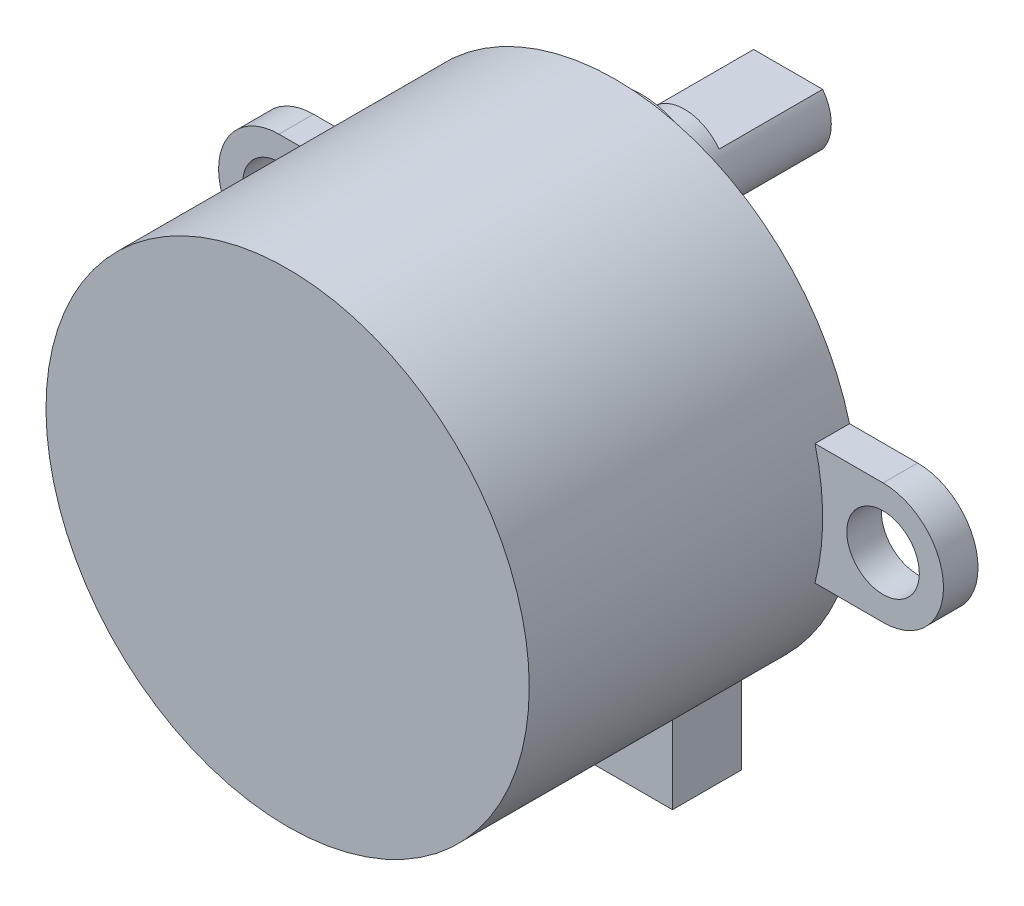
ISO-10303-21;
HEADER;
FILE_DESCRIPTION(('STEP AP214'),'2;1');
FILE_NAME('part.step','',(''),(''),'','','');
FILE_SCHEMA(('AUTOMOTIVE_DESIGN { 1 0 10303 214 1 1 1 1 }'));
ENDSEC;
DATA;
#1=APPLICATION_CONTEXT('core data for automotive mechanical design processes');
#2=APPLICATION_PROTOCOL_DEFINITION('international standard','automotive_design',2000,#1);
#3=PRODUCT_CONTEXT('',#1,'mechanical');
#4=PRODUCT('Part','Part','',(#3));
#5=PRODUCT_RELATED_PRODUCT_CATEGORY('part','',(#4));
#6=PRODUCT_DEFINITION_FORMATION('','',#4);
#7=PRODUCT_DEFINITION_CONTEXT('part definition',#1,'design');
#8=PRODUCT_DEFINITION('design','',#6,#7);
#9=PRODUCT_DEFINITION_SHAPE('','',#8);
#10=(LENGTH_UNIT() NAMED_UNIT(*) SI_UNIT(.MILLI.,.METRE.));
#11=(NAMED_UNIT(*) PLANE_ANGLE_UNIT() SI_UNIT($,.RADIAN.));
#12=(NAMED_UNIT(*) SI_UNIT($,.STERADIAN.) SOLID_ANGLE_UNIT());
#13=UNCERTAINTY_MEASURE_WITH_UNIT(LENGTH_MEASURE(1.E-05),#10,'distance_accuracy_value','');
#14=(GEOMETRIC_REPRESENTATION_CONTEXT(3) GLOBAL_UNCERTAINTY_ASSIGNED_CONTEXT((#13)) GLOBAL_UNIT_ASSIGNED_CONTEXT((#10,
#11,#12)) REPRESENTATION_CONTEXT('',''));
#15=CARTESIAN_POINT('',(0.,0.,0.));
#16=DIRECTION('',(0.,0.,1.));
#17=DIRECTION('',(1.,0.,0.));
#18=AXIS2_PLACEMENT_3D('',#15,#16,#17);
#19=CARTESIAN_POINT('',(0.,0.,19.));
#20=DIRECTION('',(0.,0.,-1.));
#21=DIRECTION('',(-1.,0.,0.));
#22=AXIS2_PLACEMENT_3D('',#19,#20,#21);
#23=CYLINDRICAL_SURFACE('',#22,14.);
#24=CARTESIAN_POINT('',(0.,0.,0.));
#25=DIRECTION('',(0.,0.,1.));
#26=DIRECTION('',(1.,0.,0.));
#27=AXIS2_PLACEMENT_3D('',#24,#25,#26);
#28=CIRCLE('',#27,14.);
#29=CARTESIAN_POINT('',(-13.555441711726,-3.49999999999999,0.));
#30=VERTEX_POINT('',#29);
#31=CARTESIAN_POINT('',(-7.3,-11.9461290801665,0.));
#32=VERTEX_POINT('',#31);
#33=EDGE_CURVE('E299',#30,#32,#28,.T.);
#34=ORIENTED_EDGE('',*,*,#33,.T.);
#35=DIRECTION('',(0.,0.,-1.));
#36=VECTOR('',#35,1.);
#37=CARTESIAN_POINT('',(-7.3,-11.9461290801665,4.));
#38=LINE('',#37,#36);
#39=CARTESIAN_POINT('',(-7.3,-11.9461290801665,4.));
#40=VERTEX_POINT('',#39);
#41=EDGE_CURVE('E222',#40,#32,#38,.T.);
#42=ORIENTED_EDGE('',*,*,#41,.F.);
#43=CARTESIAN_POINT('',(0.,0.,4.));
#44=DIRECTION('',(0.,0.,1.));
#45=DIRECTION('',(1.,0.,0.));
#46=AXIS2_PLACEMENT_3D('',#43,#44,#45);
#47=CIRCLE('',#46,14.);
#48=CARTESIAN_POINT('',(7.3,-11.9461290801665,4.));
#49=VERTEX_POINT('',#48);
#50=EDGE_CURVE('E196',#40,#49,#47,.T.);
#51=ORIENTED_EDGE('',*,*,#50,.T.);
#52=DIRECTION('',(0.,0.,-1.));
#53=VECTOR('',#52,1.);
#54=CARTESIAN_POINT('',(7.3,-11.9461290801665,4.));
#55=LINE('',#54,#53);
#56=CARTESIAN_POINT('',(7.3,-11.9461290801665,0.));
#57=VERTEX_POINT('',#56);
#58=EDGE_CURVE('E208',#49,#57,#55,.T.);
#59=ORIENTED_EDGE('',*,*,#58,.T.);
#60=CARTESIAN_POINT('',(13.555441711726,-3.49999999999999,0.));
#61=VERTEX_POINT('',#60);
#62=EDGE_CURVE('E298',#57,#61,#28,.T.);
#63=ORIENTED_EDGE('',*,*,#62,.T.);
#64=DIRECTION('',(0.,0.,-1.));
#65=VECTOR('',#64,1.);
#66=CARTESIAN_POINT('',(13.555441711726,-3.49999999999999,2.));
#67=LINE('',#66,#65);
#68=CARTESIAN_POINT('',(13.555441711726,-3.49999999999999,2.));
#69=VERTEX_POINT('',#68);
#70=EDGE_CURVE('E278',#69,#61,#67,.T.);
#71=ORIENTED_EDGE('',*,*,#70,.F.);
#72=CARTESIAN_POINT('',(0.,0.,2.));
#73=DIRECTION('',(0.,0.,1.));
#74=DIRECTION('',(1.,0.,0.));
#75=AXIS2_PLACEMENT_3D('',#72,#73,#74);
#76=CIRCLE('',#75,14.);
#77=CARTESIAN_POINT('',(13.555441711726,3.50000000000001,2.));
#78=VERTEX_POINT('',#77);
#79=EDGE_CURVE('E276',#69,#78,#76,.T.);
#80=ORIENTED_EDGE('',*,*,#79,.T.);
#81=DIRECTION('',(0.,0.,-1.));
#82=VECTOR('',#81,1.);
#83=CARTESIAN_POINT('',(13.555441711726,3.50000000000001,2.));
#84=LINE('',#83,#82);
#85=CARTESIAN_POINT('',(13.555441711726,3.50000000000001,0.));
#86=VERTEX_POINT('',#85);
#87=EDGE_CURVE('E291',#78,#86,#84,.T.);
#88=ORIENTED_EDGE('',*,*,#87,.T.);
#89=CARTESIAN_POINT('',(-13.555441711726,3.50000000000001,0.));
#90=VERTEX_POINT('',#89);
#91=EDGE_CURVE('E49',#86,#90,#28,.T.);
#92=ORIENTED_EDGE('',*,*,#91,.T.);
#93=DIRECTION('',(0.,0.,-1.));
#94=VECTOR('',#93,1.);
#95=CARTESIAN_POINT('',(-13.555441711726,3.50000000000001,2.));
#96=LINE('',#95,#94);
#97=CARTESIAN_POINT('',(-13.555441711726,3.50000000000001,2.));
#98=VERTEX_POINT('',#97);
#99=EDGE_CURVE('E256',#98,#90,#96,.T.);
#100=ORIENTED_EDGE('',*,*,#99,.F.);
#101=CARTESIAN_POINT('',(0.,0.,2.));
#102=DIRECTION('',(0.,0.,-1.));
#103=DIRECTION('',(-1.,0.,0.));
#104=AXIS2_PLACEMENT_3D('',#101,#102,#103);
#105=CIRCLE('',#104,14.);
#106=CARTESIAN_POINT('',(-13.555441711726,-3.49999999999999,2.));
#107=VERTEX_POINT('',#106);
#108=EDGE_CURVE('E233',#107,#98,#105,.T.);
#109=ORIENTED_EDGE('',*,*,#108,.F.);
#110=DIRECTION('',(0.,0.,-1.));
#111=VECTOR('',#110,1.);
#112=CARTESIAN_POINT('',(-13.555441711726,-3.49999999999999,2.));
#113=LINE('',#112,#111);
#114=EDGE_CURVE('E259',#107,#30,#113,.T.);
#115=ORIENTED_EDGE('',*,*,#114,.T.);
#116=EDGE_LOOP('',(#34,#42,#51,#59,#63,#71,#80,#88,#92,#100,#109,#115));
#117=FACE_BOUND('',#116,.T.);
#118=CARTESIAN_POINT('',(0.,0.,19.));
#119=DIRECTION('',(0.,0.,1.));
#120=DIRECTION('',(1.,0.,0.));
#121=AXIS2_PLACEMENT_3D('',#118,#119,#120);
#122=CIRCLE('',#121,14.);
#123=CARTESIAN_POINT('',(14.,0.,19.));
#124=VERTEX_POINT('',#123);
#125=EDGE_CURVE('E11',#124,#124,#122,.T.);
#126=ORIENTED_EDGE('',*,*,#125,.F.);
#127=EDGE_LOOP('',(#126));
#128=FACE_BOUND('',#127,.T.);
#129=ADVANCED_FACE('F41',(#117,#128),#23,.T.);
#130=CARTESIAN_POINT('',(0.,0.,19.));
#131=DIRECTION('',(0.,0.,1.));
#132=DIRECTION('',(1.,0.,0.));
#133=AXIS2_PLACEMENT_3D('',#130,#131,#132);
#134=PLANE('',#133);
#135=ORIENTED_EDGE('',*,*,#125,.T.);
#136=EDGE_LOOP('',(#135));
#137=FACE_BOUND('',#136,.T.);
#138=ADVANCED_FACE('F334',(#137),#134,.T.);
#139=CARTESIAN_POINT('',(0.,0.,0.));
#140=DIRECTION('',(0.,0.,1.));
#141=DIRECTION('',(1.,0.,0.));
#142=AXIS2_PLACEMENT_3D('',#139,#140,#141);
#143=PLANE('',#142);
#144=CARTESIAN_POINT('',(0.,8.,0.));
#145=DIRECTION('',(0.,0.,1.));
#146=DIRECTION('',(1.,0.,0.));
#147=AXIS2_PLACEMENT_3D('',#144,#145,#146);
#148=CIRCLE('',#147,4.5);
#149=CARTESIAN_POINT('',(4.5,8.,0.));
#150=VERTEX_POINT('',#149);
#151=EDGE_CURVE('E193',#150,#150,#148,.T.);
#152=ORIENTED_EDGE('',*,*,#151,.T.);
#153=EDGE_LOOP('',(#152));
#154=FACE_BOUND('',#153,.T.);
#155=ORIENTED_EDGE('',*,*,#91,.F.);
#156=DIRECTION('',(-1.,0.,0.));
#157=VECTOR('',#156,1.);
#158=CARTESIAN_POINT('',(0.,3.50000000000001,0.));
#159=LINE('',#158,#157);
#160=CARTESIAN_POINT('',(17.5,3.50000000000001,0.));
#161=VERTEX_POINT('',#160);
#162=EDGE_CURVE('E267',#161,#86,#159,.T.);
#163=ORIENTED_EDGE('',*,*,#162,.F.);
#164=CARTESIAN_POINT('',(17.5,0.,0.));
#165=DIRECTION('',(0.,0.,1.));
#166=DIRECTION('',(1.,0.,0.));
#167=AXIS2_PLACEMENT_3D('',#164,#165,#166);
#168=CIRCLE('',#167,3.5);
#169=CARTESIAN_POINT('',(17.5,-3.49999999999999,0.));
#170=VERTEX_POINT('',#169);
#171=EDGE_CURVE('E284',#170,#161,#168,.T.);
#172=ORIENTED_EDGE('',*,*,#171,.F.);
#173=DIRECTION('',(-1.,0.,0.));
#174=VECTOR('',#173,1.);
#175=CARTESIAN_POINT('',(0.,-3.49999999999999,0.));
#176=LINE('',#175,#174);
#177=EDGE_CURVE('E281',#170,#61,#176,.T.);
#178=ORIENTED_EDGE('',*,*,#177,.T.);
#179=ORIENTED_EDGE('',*,*,#62,.F.);
#180=DIRECTION('',(0.,-1.,0.));
#181=VECTOR('',#180,1.);
#182=CARTESIAN_POINT('',(7.3,0.,0.));
#183=LINE('',#182,#181);
#184=CARTESIAN_POINT('',(7.3,-17.,0.));
#185=VERTEX_POINT('',#184);
#186=EDGE_CURVE('E199',#57,#185,#183,.T.);
#187=ORIENTED_EDGE('',*,*,#186,.T.);
#188=DIRECTION('',(-1.,0.,0.));
#189=VECTOR('',#188,1.);
#190=CARTESIAN_POINT('',(0.,-17.,0.));
#191=LINE('',#190,#189);
#192=CARTESIAN_POINT('',(-7.3,-17.,0.));
#193=VERTEX_POINT('',#192);
#194=EDGE_CURVE('E211',#185,#193,#191,.T.);
#195=ORIENTED_EDGE('',*,*,#194,.T.);
#196=DIRECTION('',(0.,1.,0.));
#197=VECTOR('',#196,1.);
#198=CARTESIAN_POINT('',(-7.3,0.,0.));
#199=LINE('',#198,#197);
#200=EDGE_CURVE('E192',#193,#32,#199,.T.);
#201=ORIENTED_EDGE('',*,*,#200,.T.);
#202=ORIENTED_EDGE('',*,*,#33,.F.);
#203=DIRECTION('',(1.,0.,0.));
#204=VECTOR('',#203,1.);
#205=CARTESIAN_POINT('',(0.,-3.49999999999999,0.));
#206=LINE('',#205,#204);
#207=CARTESIAN_POINT('',(-17.5,-3.49999999999999,0.));
#208=VERTEX_POINT('',#207);
#209=EDGE_CURVE('E245',#208,#30,#206,.T.);
#210=ORIENTED_EDGE('',*,*,#209,.F.);
#211=CARTESIAN_POINT('',(-17.5,0.,0.));
#212=DIRECTION('',(0.,0.,-1.));
#213=DIRECTION('',(-1.,0.,0.));
#214=AXIS2_PLACEMENT_3D('',#211,#212,#213);
#215=CIRCLE('',#214,3.5);
#216=CARTESIAN_POINT('',(-17.5,3.50000000000001,0.));
#217=VERTEX_POINT('',#216);
#218=EDGE_CURVE('E230',#208,#217,#215,.T.);
#219=ORIENTED_EDGE('',*,*,#218,.T.);
#220=DIRECTION('',(1.,0.,0.));
#221=VECTOR('',#220,1.);
#222=CARTESIAN_POINT('',(0.,3.50000000000001,0.));
#223=LINE('',#222,#221);
#224=EDGE_CURVE('E248',#217,#90,#223,.T.);
#225=ORIENTED_EDGE('',*,*,#224,.T.);
#226=EDGE_LOOP('',(#155,#163,#172,#178,#179,#187,#195,#201,#202,#210,#219,#225));
#227=FACE_BOUND('',#226,.T.);
#228=CARTESIAN_POINT('',(17.5,0.,0.));
#229=DIRECTION('',(0.,0.,1.));
#230=DIRECTION('',(1.,0.,0.));
#231=AXIS2_PLACEMENT_3D('',#228,#229,#230);
#232=CIRCLE('',#231,2.1);
#233=CARTESIAN_POINT('',(19.6,0.,0.));
#234=VERTEX_POINT('',#233);
#235=EDGE_CURVE('E262',#234,#234,#232,.T.);
#236=ORIENTED_EDGE('',*,*,#235,.T.);
#237=EDGE_LOOP('',(#236));
#238=FACE_BOUND('',#237,.T.);
#239=CARTESIAN_POINT('',(-17.5,0.,0.));
#240=DIRECTION('',(0.,0.,-1.));
#241=DIRECTION('',(-1.,0.,0.));
#242=AXIS2_PLACEMENT_3D('',#239,#240,#241);
#243=CIRCLE('',#242,2.1);
#244=CARTESIAN_POINT('',(-19.6,0.,0.));
#245=VERTEX_POINT('',#244);
#246=EDGE_CURVE('E225',#245,#245,#243,.T.);
#247=ORIENTED_EDGE('',*,*,#246,.F.);
#248=EDGE_LOOP('',(#247));
#249=FACE_BOUND('',#248,.T.);
#250=ADVANCED_FACE('F311',(#154,#227,#238,#249),#143,.F.);
#251=CARTESIAN_POINT('',(0.,-3.49999999999999,2.));
#252=DIRECTION('',(0.,-1.,0.));
#253=DIRECTION('',(0.,0.,-1.));
#254=AXIS2_PLACEMENT_3D('',#251,#252,#253);
#255=PLANE('',#254);
#256=ORIENTED_EDGE('',*,*,#177,.F.);
#257=DIRECTION('',(0.,0.,-1.));
#258=VECTOR('',#257,1.);
#259=CARTESIAN_POINT('',(17.5,-3.49999999999999,2.));
#260=LINE('',#259,#258);
#261=CARTESIAN_POINT('',(17.5,-3.49999999999999,2.));
#262=VERTEX_POINT('',#261);
#263=EDGE_CURVE('E297',#262,#170,#260,.T.);
#264=ORIENTED_EDGE('',*,*,#263,.F.);
#265=DIRECTION('',(-1.,0.,0.));
#266=VECTOR('',#265,1.);
#267=CARTESIAN_POINT('',(0.,-3.49999999999999,2.));
#268=LINE('',#267,#266);
#269=EDGE_CURVE('E266',#262,#69,#268,.T.);
#270=ORIENTED_EDGE('',*,*,#269,.T.);
#271=ORIENTED_EDGE('',*,*,#70,.T.);
#272=EDGE_LOOP('',(#256,#264,#270,#271));
#273=FACE_BOUND('',#272,.T.);
#274=ADVANCED_FACE('F307',(#273),#255,.T.);
#275=CARTESIAN_POINT('',(17.5,0.,2.));
#276=DIRECTION('',(0.,0.,-1.));
#277=DIRECTION('',(-1.,0.,0.));
#278=AXIS2_PLACEMENT_3D('',#275,#276,#277);
#279=CYLINDRICAL_SURFACE('',#278,3.5);
#280=ORIENTED_EDGE('',*,*,#171,.T.);
#281=DIRECTION('',(0.,0.,-1.));
#282=VECTOR('',#281,1.);
#283=CARTESIAN_POINT('',(17.5,3.50000000000001,2.));
#284=LINE('',#283,#282);
#285=CARTESIAN_POINT('',(17.5,3.50000000000001,2.));
#286=VERTEX_POINT('',#285);
#287=EDGE_CURVE('E294',#286,#161,#284,.T.);
#288=ORIENTED_EDGE('',*,*,#287,.F.);
#289=CARTESIAN_POINT('',(17.5,0.,2.));
#290=DIRECTION('',(0.,0.,1.));
#291=DIRECTION('',(1.,0.,0.));
#292=AXIS2_PLACEMENT_3D('',#289,#290,#291);
#293=CIRCLE('',#292,3.5);
#294=EDGE_CURVE('E270',#262,#286,#293,.T.);
#295=ORIENTED_EDGE('',*,*,#294,.F.);
#296=ORIENTED_EDGE('',*,*,#263,.T.);
#297=EDGE_LOOP('',(#280,#288,#295,#296));
#298=FACE_BOUND('',#297,.T.);
#299=ADVANCED_FACE('F315',(#298),#279,.T.);
#300=CARTESIAN_POINT('',(0.,3.50000000000001,2.));
#301=DIRECTION('',(0.,-1.,0.));
#302=DIRECTION('',(0.,0.,-1.));
#303=AXIS2_PLACEMENT_3D('',#300,#301,#302);
#304=PLANE('',#303);
#305=ORIENTED_EDGE('',*,*,#162,.T.);
#306=ORIENTED_EDGE('',*,*,#87,.F.);
#307=DIRECTION('',(-1.,0.,0.));
#308=VECTOR('',#307,1.);
#309=CARTESIAN_POINT('',(0.,3.50000000000001,2.));
#310=LINE('',#309,#308);
#311=EDGE_CURVE('E273',#286,#78,#310,.T.);
#312=ORIENTED_EDGE('',*,*,#311,.F.);
#313=ORIENTED_EDGE('',*,*,#287,.T.);
#314=EDGE_LOOP('',(#305,#306,#312,#313));
#315=FACE_BOUND('',#314,.T.);
#316=ADVANCED_FACE('F321',(#315),#304,.F.);
#317=CARTESIAN_POINT('',(17.5,0.,2.));
#318=DIRECTION('',(0.,0.,-1.));
#319=DIRECTION('',(-1.,0.,0.));
#320=AXIS2_PLACEMENT_3D('',#317,#318,#319);
#321=CYLINDRICAL_SURFACE('',#320,2.1);
#322=CARTESIAN_POINT('',(17.5,0.,2.));
#323=DIRECTION('',(0.,0.,1.));
#324=DIRECTION('',(1.,0.,0.));
#325=AXIS2_PLACEMENT_3D('',#322,#323,#324);
#326=CIRCLE('',#325,2.1);
#327=CARTESIAN_POINT('',(19.6,0.,2.));
#328=VERTEX_POINT('',#327);
#329=EDGE_CURVE('E263',#328,#328,#326,.T.);
#330=ORIENTED_EDGE('',*,*,#329,.T.);
#331=EDGE_LOOP('',(#330));
#332=FACE_BOUND('',#331,.T.);
#333=ORIENTED_EDGE('',*,*,#235,.F.);
#334=EDGE_LOOP('',(#333));
#335=FACE_BOUND('',#334,.T.);
#336=ADVANCED_FACE('F323',(#332,#335),#321,.F.);
#337=CARTESIAN_POINT('',(0.,0.,2.));
#338=DIRECTION('',(0.,0.,1.));
#339=DIRECTION('',(1.,0.,0.));
#340=AXIS2_PLACEMENT_3D('',#337,#338,#339);
#341=PLANE('',#340);
#342=ORIENTED_EDGE('',*,*,#329,.F.);
#343=EDGE_LOOP('',(#342));
#344=FACE_BOUND('',#343,.T.);
#345=ORIENTED_EDGE('',*,*,#269,.F.);
#346=ORIENTED_EDGE('',*,*,#294,.T.);
#347=ORIENTED_EDGE('',*,*,#311,.T.);
#348=ORIENTED_EDGE('',*,*,#79,.F.);
#349=EDGE_LOOP('',(#345,#346,#347,#348));
#350=FACE_BOUND('',#349,.T.);
#351=ADVANCED_FACE('F318',(#344,#350),#341,.T.);
#352=CARTESIAN_POINT('',(0.,-3.49999999999999,2.));
#353=DIRECTION('',(0.,1.,0.));
#354=DIRECTION('',(0.,0.,1.));
#355=AXIS2_PLACEMENT_3D('',#352,#353,#354);
#356=PLANE('',#355);
#357=ORIENTED_EDGE('',*,*,#209,.T.);
#358=ORIENTED_EDGE('',*,*,#114,.F.);
#359=DIRECTION('',(1.,0.,0.));
#360=VECTOR('',#359,1.);
#361=CARTESIAN_POINT('',(0.,-3.49999999999999,2.));
#362=LINE('',#361,#360);
#363=CARTESIAN_POINT('',(-17.5,-3.49999999999999,2.));
#364=VERTEX_POINT('',#363);
#365=EDGE_CURVE('E229',#364,#107,#362,.T.);
#366=ORIENTED_EDGE('',*,*,#365,.F.);
#367=DIRECTION('',(0.,0.,-1.));
#368=VECTOR('',#367,1.);
#369=CARTESIAN_POINT('',(-17.5,-3.49999999999999,2.));
#370=LINE('',#369,#368);
#371=EDGE_CURVE('E242',#364,#208,#370,.T.);
#372=ORIENTED_EDGE('',*,*,#371,.T.);
#373=EDGE_LOOP('',(#357,#358,#366,#372));
#374=FACE_BOUND('',#373,.T.);
#375=ADVANCED_FACE('F376',(#374),#356,.F.);
#376=CARTESIAN_POINT('',(0.,3.50000000000001,2.));
#377=DIRECTION('',(0.,1.,0.));
#378=DIRECTION('',(0.,0.,1.));
#379=AXIS2_PLACEMENT_3D('',#376,#377,#378);
#380=PLANE('',#379);
#381=ORIENTED_EDGE('',*,*,#224,.F.);
#382=DIRECTION('',(0.,0.,-1.));
#383=VECTOR('',#382,1.);
#384=CARTESIAN_POINT('',(-17.5,3.50000000000001,2.));
#385=LINE('',#384,#383);
#386=CARTESIAN_POINT('',(-17.5,3.50000000000001,2.));
#387=VERTEX_POINT('',#386);
#388=EDGE_CURVE('E254',#387,#217,#385,.T.);
#389=ORIENTED_EDGE('',*,*,#388,.F.);
#390=DIRECTION('',(1.,0.,0.));
#391=VECTOR('',#390,1.);
#392=CARTESIAN_POINT('',(0.,3.50000000000001,2.));
#393=LINE('',#392,#391);
#394=EDGE_CURVE('E236',#387,#98,#393,.T.);
#395=ORIENTED_EDGE('',*,*,#394,.T.);
#396=ORIENTED_EDGE('',*,*,#99,.T.);
#397=EDGE_LOOP('',(#381,#389,#395,#396));
#398=FACE_BOUND('',#397,.T.);
#399=ADVANCED_FACE('F400',(#398),#380,.T.);
#400=CARTESIAN_POINT('',(-17.5,0.,2.));
#401=DIRECTION('',(0.,0.,-1.));
#402=DIRECTION('',(-1.,0.,0.));
#403=AXIS2_PLACEMENT_3D('',#400,#401,#402);
#404=CYLINDRICAL_SURFACE('',#403,2.1);
#405=CARTESIAN_POINT('',(-17.5,0.,2.));
#406=DIRECTION('',(0.,0.,-1.));
#407=DIRECTION('',(-1.,0.,0.));
#408=AXIS2_PLACEMENT_3D('',#405,#406,#407);
#409=CIRCLE('',#408,2.1);
#410=CARTESIAN_POINT('',(-19.6,0.,2.));
#411=VERTEX_POINT('',#410);
#412=EDGE_CURVE('E226',#411,#411,#409,.T.);
#413=ORIENTED_EDGE('',*,*,#412,.F.);
#414=EDGE_LOOP('',(#413));
#415=FACE_BOUND('',#414,.T.);
#416=ORIENTED_EDGE('',*,*,#246,.T.);
#417=EDGE_LOOP('',(#416));
#418=FACE_BOUND('',#417,.T.);
#419=ADVANCED_FACE('F410',(#415,#418),#404,.F.);
#420=CARTESIAN_POINT('',(-17.5,0.,2.));
#421=DIRECTION('',(0.,0.,-1.));
#422=DIRECTION('',(-1.,0.,0.));
#423=AXIS2_PLACEMENT_3D('',#420,#421,#422);
#424=CYLINDRICAL_SURFACE('',#423,3.5);
#425=ORIENTED_EDGE('',*,*,#218,.F.);
#426=ORIENTED_EDGE('',*,*,#371,.F.);
#427=CARTESIAN_POINT('',(-17.5,0.,2.));
#428=DIRECTION('',(0.,0.,-1.));
#429=DIRECTION('',(-1.,0.,0.));
#430=AXIS2_PLACEMENT_3D('',#427,#428,#429);
#431=CIRCLE('',#430,3.5);
#432=EDGE_CURVE('E239',#364,#387,#431,.T.);
#433=ORIENTED_EDGE('',*,*,#432,.T.);
#434=ORIENTED_EDGE('',*,*,#388,.T.);
#435=EDGE_LOOP('',(#425,#426,#433,#434));
#436=FACE_BOUND('',#435,.T.);
#437=ADVANCED_FACE('F420',(#436),#424,.T.);
#438=CARTESIAN_POINT('',(0.,0.,2.));
#439=DIRECTION('',(0.,0.,1.));
#440=DIRECTION('',(-1.,0.,0.));
#441=AXIS2_PLACEMENT_3D('',#438,#439,#440);
#442=PLANE('',#441);
#443=ORIENTED_EDGE('',*,*,#412,.T.);
#444=EDGE_LOOP('',(#443));
#445=FACE_BOUND('',#444,.T.);
#446=ORIENTED_EDGE('',*,*,#365,.T.);
#447=ORIENTED_EDGE('',*,*,#108,.T.);
#448=ORIENTED_EDGE('',*,*,#394,.F.);
#449=ORIENTED_EDGE('',*,*,#432,.F.);
#450=EDGE_LOOP('',(#446,#447,#448,#449));
#451=FACE_BOUND('',#450,.T.);
#452=ADVANCED_FACE('F429',(#445,#451),#442,.T.);
#453=CARTESIAN_POINT('',(-7.3,0.,4.));
#454=DIRECTION('',(-1.,0.,0.));
#455=DIRECTION('',(0.,0.,1.));
#456=AXIS2_PLACEMENT_3D('',#453,#454,#455);
#457=PLANE('',#456);
#458=ORIENTED_EDGE('',*,*,#200,.F.);
#459=DIRECTION('',(0.,0.,-1.));
#460=VECTOR('',#459,1.);
#461=CARTESIAN_POINT('',(-7.3,-17.,4.));
#462=LINE('',#461,#460);
#463=CARTESIAN_POINT('',(-7.3,-17.,4.));
#464=VERTEX_POINT('',#463);
#465=EDGE_CURVE('E220',#464,#193,#462,.T.);
#466=ORIENTED_EDGE('',*,*,#465,.F.);
#467=DIRECTION('',(0.,1.,0.));
#468=VECTOR('',#467,1.);
#469=CARTESIAN_POINT('',(-7.3,0.,4.));
#470=LINE('',#469,#468);
#471=EDGE_CURVE('E198',#464,#40,#470,.T.);
#472=ORIENTED_EDGE('',*,*,#471,.T.);
#473=ORIENTED_EDGE('',*,*,#41,.T.);
#474=EDGE_LOOP('',(#458,#466,#472,#473));
#475=FACE_BOUND('',#474,.T.);
#476=ADVANCED_FACE('F437',(#475),#457,.T.);
#477=CARTESIAN_POINT('',(0.,-17.,4.));
#478=DIRECTION('',(0.,-1.,0.));
#479=DIRECTION('',(0.,0.,-1.));
#480=AXIS2_PLACEMENT_3D('',#477,#478,#479);
#481=PLANE('',#480);
#482=ORIENTED_EDGE('',*,*,#194,.F.);
#483=DIRECTION('',(0.,0.,-1.));
#484=VECTOR('',#483,1.);
#485=CARTESIAN_POINT('',(7.3,-17.,4.));
#486=LINE('',#485,#484);
#487=CARTESIAN_POINT('',(7.3,-17.,4.));
#488=VERTEX_POINT('',#487);
#489=EDGE_CURVE('E218',#488,#185,#486,.T.);
#490=ORIENTED_EDGE('',*,*,#489,.F.);
#491=DIRECTION('',(-1.,0.,0.));
#492=VECTOR('',#491,1.);
#493=CARTESIAN_POINT('',(0.,-17.,4.));
#494=LINE('',#493,#492);
#495=EDGE_CURVE('E202',#488,#464,#494,.T.);
#496=ORIENTED_EDGE('',*,*,#495,.T.);
#497=ORIENTED_EDGE('',*,*,#465,.T.);
#498=EDGE_LOOP('',(#482,#490,#496,#497));
#499=FACE_BOUND('',#498,.T.);
#500=ADVANCED_FACE('F445',(#499),#481,.T.);
#501=CARTESIAN_POINT('',(7.3,0.,4.));
#502=DIRECTION('',(1.,0.,0.));
#503=DIRECTION('',(0.,0.,-1.));
#504=AXIS2_PLACEMENT_3D('',#501,#502,#503);
#505=PLANE('',#504);
#506=ORIENTED_EDGE('',*,*,#186,.F.);
#507=ORIENTED_EDGE('',*,*,#58,.F.);
#508=DIRECTION('',(0.,-1.,0.));
#509=VECTOR('',#508,1.);
#510=CARTESIAN_POINT('',(7.3,0.,4.));
#511=LINE('',#510,#509);
#512=EDGE_CURVE('E205',#49,#488,#511,.T.);
#513=ORIENTED_EDGE('',*,*,#512,.T.);
#514=ORIENTED_EDGE('',*,*,#489,.T.);
#515=EDGE_LOOP('',(#506,#507,#513,#514));
#516=FACE_BOUND('',#515,.T.);
#517=ADVANCED_FACE('F454',(#516),#505,.T.);
#518=CARTESIAN_POINT('',(0.,0.,4.));
#519=DIRECTION('',(0.,0.,1.));
#520=DIRECTION('',(1.,0.,0.));
#521=AXIS2_PLACEMENT_3D('',#518,#519,#520);
#522=PLANE('',#521);
#523=ORIENTED_EDGE('',*,*,#50,.F.);
#524=ORIENTED_EDGE('',*,*,#471,.F.);
#525=ORIENTED_EDGE('',*,*,#495,.F.);
#526=ORIENTED_EDGE('',*,*,#512,.F.);
#527=EDGE_LOOP('',(#523,#524,#525,#526));
#528=FACE_BOUND('',#527,.T.);
#529=ADVANCED_FACE('F463',(#528),#522,.T.);
#530=CARTESIAN_POINT('',(0.,8.,-1.5));
#531=DIRECTION('',(0.,0.,1.));
#532=DIRECTION('',(1.,0.,0.));
#533=AXIS2_PLACEMENT_3D('',#530,#531,#532);
#534=CYLINDRICAL_SURFACE('',#533,4.5);
#535=CARTESIAN_POINT('',(0.,8.,-1.5));
#536=DIRECTION('',(0.,0.,1.));
#537=DIRECTION('',(1.,0.,0.));
#538=AXIS2_PLACEMENT_3D('',#535,#536,#537);
#539=CIRCLE('',#538,4.5);
#540=CARTESIAN_POINT('',(4.5,8.,-1.5));
#541=VERTEX_POINT('',#540);
#542=EDGE_CURVE('E189',#541,#541,#539,.T.);
#543=ORIENTED_EDGE('',*,*,#542,.T.);
#544=EDGE_LOOP('',(#543));
#545=FACE_BOUND('',#544,.T.);
#546=ORIENTED_EDGE('',*,*,#151,.F.);
#547=EDGE_LOOP('',(#546));
#548=FACE_BOUND('',#547,.T.);
#549=ADVANCED_FACE('F472',(#545,#548),#534,.T.);
#550=CARTESIAN_POINT('',(0.,8.,-1.5));
#551=DIRECTION('',(0.,0.,1.));
#552=DIRECTION('',(1.,0.,0.));
#553=AXIS2_PLACEMENT_3D('',#550,#551,#552);
#554=PLANE('',#553);
#555=CARTESIAN_POINT('',(0.,8.,-1.5));
#556=DIRECTION('',(0.,0.,1.));
#557=DIRECTION('',(1.,0.,0.));
#558=AXIS2_PLACEMENT_3D('',#555,#556,#557);
#559=CIRCLE('',#558,2.5);
#560=CARTESIAN_POINT('',(2.5,8.,-1.5));
#561=VERTEX_POINT('',#560);
#562=EDGE_CURVE('E44',#561,#561,#559,.T.);
#563=ORIENTED_EDGE('',*,*,#562,.T.);
#564=EDGE_LOOP('',(#563));
#565=FACE_BOUND('',#564,.T.);
#566=ORIENTED_EDGE('',*,*,#542,.F.);
#567=EDGE_LOOP('',(#566));
#568=FACE_BOUND('',#567,.T.);
#569=ADVANCED_FACE('F481',(#565,#568),#554,.F.);
#570=CARTESIAN_POINT('',(0.,8.,-10.));
#571=DIRECTION('',(0.,0.,1.));
#572=DIRECTION('',(1.,0.,0.));
#573=AXIS2_PLACEMENT_3D('',#570,#571,#572);
#574=CYLINDRICAL_SURFACE('',#573,2.5);
#575=DIRECTION('',(0.,0.,-1.));
#576=VECTOR('',#575,1.);
#577=CARTESIAN_POINT('',(2.,9.5,-4.));
#578=LINE('',#577,#576);
#579=CARTESIAN_POINT('',(2.,9.5,-4.));
#580=VERTEX_POINT('',#579);
#581=CARTESIAN_POINT('',(2.,9.5,-10.));
#582=VERTEX_POINT('',#581);
#583=EDGE_CURVE('E65',#580,#582,#578,.T.);
#584=ORIENTED_EDGE('',*,*,#583,.F.);
#585=CARTESIAN_POINT('',(0.,8.,-4.));
#586=DIRECTION('',(0.,0.,-1.));
#587=DIRECTION('',(-1.,0.,0.));
#588=AXIS2_PLACEMENT_3D('',#585,#586,#587);
#589=CIRCLE('',#588,2.5);
#590=CARTESIAN_POINT('',(-2.,9.5,-4.));
#591=VERTEX_POINT('',#590);
#592=EDGE_CURVE('E157',#591,#580,#589,.T.);
#593=ORIENTED_EDGE('',*,*,#592,.F.);
#594=DIRECTION('',(0.,0.,-1.));
#595=VECTOR('',#594,1.);
#596=CARTESIAN_POINT('',(-2.,9.5,-4.));
#597=LINE('',#596,#595);
#598=CARTESIAN_POINT('',(-2.,9.5,-10.));
#599=VERTEX_POINT('',#598);
#600=EDGE_CURVE('E165',#591,#599,#597,.T.);
#601=ORIENTED_EDGE('',*,*,#600,.T.);
#602=CARTESIAN_POINT('',(0.,8.,-10.));
#603=DIRECTION('',(0.,0.,1.));
#604=DIRECTION('',(1.,0.,0.));
#605=AXIS2_PLACEMENT_3D('',#602,#603,#604);
#606=CIRCLE('',#605,2.5);
#607=CARTESIAN_POINT('',(-2.,6.5,-10.));
#608=VERTEX_POINT('',#607);
#609=EDGE_CURVE('E188',#599,#608,#606,.T.);
#610=ORIENTED_EDGE('',*,*,#609,.T.);
#611=DIRECTION('',(0.,0.,-1.));
#612=VECTOR('',#611,1.);
#613=CARTESIAN_POINT('',(-2.,6.5,-4.));
#614=LINE('',#613,#612);
#615=CARTESIAN_POINT('',(-2.,6.5,-4.));
#616=VERTEX_POINT('',#615);
#617=EDGE_CURVE('E57',#616,#608,#614,.T.);
#618=ORIENTED_EDGE('',*,*,#617,.F.);
#619=CARTESIAN_POINT('',(0.,8.,-4.));
#620=DIRECTION('',(0.,0.,-1.));
#621=DIRECTION('',(-1.,0.,0.));
#622=AXIS2_PLACEMENT_3D('',#619,#620,#621);
#623=CIRCLE('',#622,2.5);
#624=CARTESIAN_POINT('',(2.,6.5,-4.));
#625=VERTEX_POINT('',#624);
#626=EDGE_CURVE('E177',#625,#616,#623,.T.);
#627=ORIENTED_EDGE('',*,*,#626,.F.);
#628=DIRECTION('',(0.,0.,-1.));
#629=VECTOR('',#628,1.);
#630=CARTESIAN_POINT('',(2.,6.5,-4.));
#631=LINE('',#630,#629);
#632=CARTESIAN_POINT('',(2.,6.5,-10.));
#633=VERTEX_POINT('',#632);
#634=EDGE_CURVE('E184',#625,#633,#631,.T.);
#635=ORIENTED_EDGE('',*,*,#634,.T.);
#636=EDGE_CURVE('E172',#633,#582,#606,.T.);
#637=ORIENTED_EDGE('',*,*,#636,.T.);
#638=EDGE_LOOP('',(#584,#593,#601,#610,#618,#627,#635,#637));
#639=FACE_BOUND('',#638,.T.);
#640=ORIENTED_EDGE('',*,*,#562,.F.);
#641=EDGE_LOOP('',(#640));
#642=FACE_BOUND('',#641,.T.);
#643=ADVANCED_FACE('F168',(#639,#642),#574,.T.);
#644=CARTESIAN_POINT('',(0.,8.,-10.));
#645=DIRECTION('',(0.,0.,1.));
#646=DIRECTION('',(1.,0.,0.));
#647=AXIS2_PLACEMENT_3D('',#644,#645,#646);
#648=PLANE('',#647);
#649=ORIENTED_EDGE('',*,*,#609,.F.);
#650=DIRECTION('',(-1.,0.,0.));
#651=VECTOR('',#650,1.);
#652=CARTESIAN_POINT('',(0.,9.5,-10.));
#653=LINE('',#652,#651);
#654=EDGE_CURVE('E162',#582,#599,#653,.T.);
#655=ORIENTED_EDGE('',*,*,#654,.F.);
#656=ORIENTED_EDGE('',*,*,#636,.F.);
#657=DIRECTION('',(1.,0.,0.));
#658=VECTOR('',#657,1.);
#659=CARTESIAN_POINT('',(0.,6.5,-10.));
#660=LINE('',#659,#658);
#661=EDGE_CURVE('E180',#608,#633,#660,.T.);
#662=ORIENTED_EDGE('',*,*,#661,.F.);
#663=EDGE_LOOP('',(#649,#655,#656,#662));
#664=FACE_BOUND('',#663,.T.);
#665=ADVANCED_FACE('F498',(#664),#648,.F.);
#666=CARTESIAN_POINT('',(0.,6.5,-4.));
#667=DIRECTION('',(0.,1.,0.));
#668=DIRECTION('',(0.,0.,1.));
#669=AXIS2_PLACEMENT_3D('',#666,#667,#668);
#670=PLANE('',#669);
#671=ORIENTED_EDGE('',*,*,#661,.T.);
#672=ORIENTED_EDGE('',*,*,#634,.F.);
#673=DIRECTION('',(1.,0.,0.));
#674=VECTOR('',#673,1.);
#675=CARTESIAN_POINT('',(0.,6.5,-4.));
#676=LINE('',#675,#674);
#677=EDGE_CURVE('E179',#616,#625,#676,.T.);
#678=ORIENTED_EDGE('',*,*,#677,.F.);
#679=ORIENTED_EDGE('',*,*,#617,.T.);
#680=EDGE_LOOP('',(#671,#672,#678,#679));
#681=FACE_BOUND('',#680,.T.);
#682=ADVANCED_FACE('F506',(#681),#670,.F.);
#683=CARTESIAN_POINT('',(0.,0.,-4.));
#684=DIRECTION('',(0.,0.,-1.));
#685=DIRECTION('',(-1.,0.,0.));
#686=AXIS2_PLACEMENT_3D('',#683,#684,#685);
#687=PLANE('',#686);
#688=ORIENTED_EDGE('',*,*,#626,.T.);
#689=ORIENTED_EDGE('',*,*,#677,.T.);
#690=EDGE_LOOP('',(#688,#689));
#691=FACE_BOUND('',#690,.T.);
#692=ADVANCED_FACE('F515',(#691),#687,.T.);
#693=CARTESIAN_POINT('',(0.,9.5,-4.));
#694=DIRECTION('',(0.,-1.,0.));
#695=DIRECTION('',(1.,0.,0.));
#696=AXIS2_PLACEMENT_3D('',#693,#694,#695);
#697=PLANE('',#696);
#698=ORIENTED_EDGE('',*,*,#654,.T.);
#699=ORIENTED_EDGE('',*,*,#600,.F.);
#700=DIRECTION('',(-1.,0.,0.));
#701=VECTOR('',#700,1.);
#702=CARTESIAN_POINT('',(0.,9.5,-4.));
#703=LINE('',#702,#701);
#704=EDGE_CURVE('E159',#580,#591,#703,.T.);
#705=ORIENTED_EDGE('',*,*,#704,.F.);
#706=ORIENTED_EDGE('',*,*,#583,.T.);
#707=EDGE_LOOP('',(#698,#699,#705,#706));
#708=FACE_BOUND('',#707,.T.);
#709=ADVANCED_FACE('F164',(#708),#697,.F.);
#710=CARTESIAN_POINT('',(0.,0.,-4.));
#711=DIRECTION('',(0.,0.,-1.));
#712=DIRECTION('',(-1.,0.,0.));
#713=AXIS2_PLACEMENT_3D('',#710,#711,#712);
#714=PLANE('',#713);
#715=ORIENTED_EDGE('',*,*,#592,.T.);
#716=ORIENTED_EDGE('',*,*,#704,.T.);
#717=EDGE_LOOP('',(#715,#716));
#718=FACE_BOUND('',#717,.T.);
#719=ADVANCED_FACE('F158',(#718),#714,.T.);
#720=CLOSED_SHELL('',(#129,#138,#250,#274,#299,#316,#336,#351,#375,#399,#419,#437,#452,#476,
#500,#517,#529,#549,#569,#643,#665,#682,#692,#709,#719));
#721=MANIFOLD_SOLID_BREP('B2',#720);
#722=ADVANCED_BREP_SHAPE_REPRESENTATION('',(#18,#721),#14);
#723=SHAPE_DEFINITION_REPRESENTATION(#9,#722);
ENDSEC;
END-ISO-10303-21;
